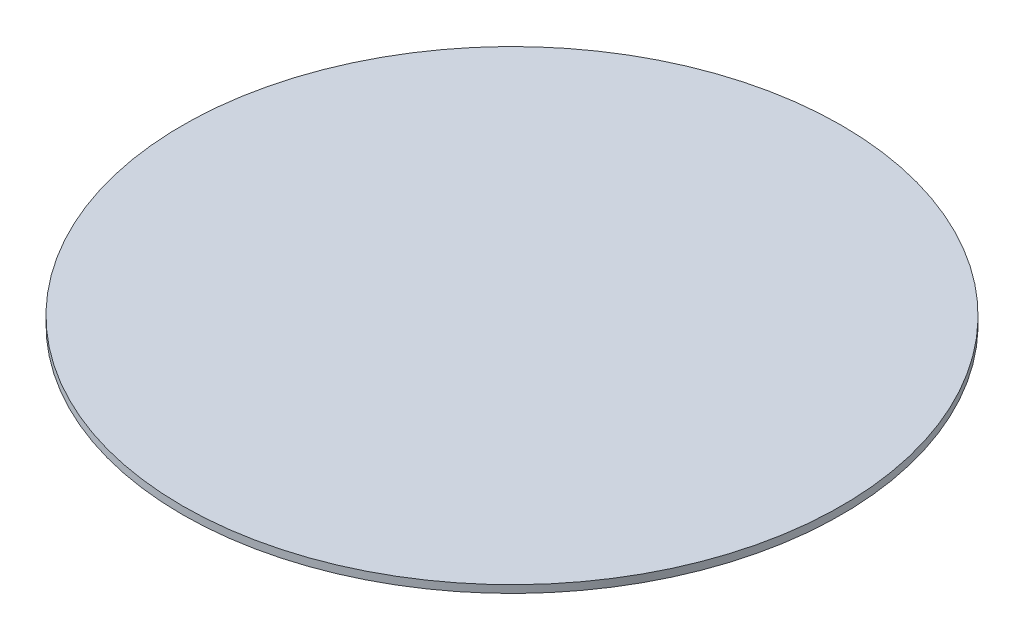
ISO-10303-21;
HEADER;
FILE_DESCRIPTION(('STEP AP214'),'2;1');
FILE_NAME('part.step','',(''),(''),'','','');
FILE_SCHEMA(('AUTOMOTIVE_DESIGN { 1 0 10303 214 1 1 1 1 }'));
ENDSEC;
DATA;
#1=APPLICATION_CONTEXT('core data for automotive mechanical design processes');
#2=APPLICATION_PROTOCOL_DEFINITION('international standard','automotive_design',2000,#1);
#3=PRODUCT_CONTEXT('',#1,'mechanical');
#4=PRODUCT('Part','Part','',(#3));
#5=PRODUCT_RELATED_PRODUCT_CATEGORY('part','',(#4));
#6=PRODUCT_DEFINITION_FORMATION('','',#4);
#7=PRODUCT_DEFINITION_CONTEXT('part definition',#1,'design');
#8=PRODUCT_DEFINITION('design','',#6,#7);
#9=PRODUCT_DEFINITION_SHAPE('','',#8);
#10=(LENGTH_UNIT() NAMED_UNIT(*) SI_UNIT(.MILLI.,.METRE.));
#11=(NAMED_UNIT(*) PLANE_ANGLE_UNIT() SI_UNIT($,.RADIAN.));
#12=(NAMED_UNIT(*) SI_UNIT($,.STERADIAN.) SOLID_ANGLE_UNIT());
#13=UNCERTAINTY_MEASURE_WITH_UNIT(LENGTH_MEASURE(1.E-05),#10,'distance_accuracy_value','');
#14=(GEOMETRIC_REPRESENTATION_CONTEXT(3) GLOBAL_UNCERTAINTY_ASSIGNED_CONTEXT((#13)) GLOBAL_UNIT_ASSIGNED_CONTEXT((#10,
#11,#12)) REPRESENTATION_CONTEXT('',''));
#15=CARTESIAN_POINT('',(0.,0.,0.));
#16=DIRECTION('',(0.,0.,1.));
#17=DIRECTION('',(1.,0.,0.));
#18=AXIS2_PLACEMENT_3D('',#15,#16,#17);
#19=CARTESIAN_POINT('',(0.,3.,0.));
#20=DIRECTION('',(0.,-1.,0.));
#21=DIRECTION('',(0.,0.,-1.));
#22=AXIS2_PLACEMENT_3D('',#19,#20,#21);
#23=CYLINDRICAL_SURFACE('',#22,130.);
#24=CARTESIAN_POINT('',(0.,3.,0.));
#25=DIRECTION('',(0.,1.,0.));
#26=DIRECTION('',(0.,0.,1.));
#27=AXIS2_PLACEMENT_3D('',#24,#25,#26);
#28=CIRCLE('',#27,130.);
#29=CARTESIAN_POINT('',(0.,3.,130.));
#30=VERTEX_POINT('',#29);
#31=EDGE_CURVE('E10',#30,#30,#28,.T.);
#32=ORIENTED_EDGE('',*,*,#31,.F.);
#33=EDGE_LOOP('',(#32));
#34=FACE_BOUND('',#33,.T.);
#35=CARTESIAN_POINT('',(0.,0.,0.));
#36=DIRECTION('',(0.,1.,0.));
#37=DIRECTION('',(0.,0.,1.));
#38=AXIS2_PLACEMENT_3D('',#35,#36,#37);
#39=CIRCLE('',#38,130.);
#40=CARTESIAN_POINT('',(0.,0.,130.));
#41=VERTEX_POINT('',#40);
#42=EDGE_CURVE('E34',#41,#41,#39,.T.);
#43=ORIENTED_EDGE('',*,*,#42,.T.);
#44=EDGE_LOOP('',(#43));
#45=FACE_BOUND('',#44,.T.);
#46=ADVANCED_FACE('F31',(#34,#45),#23,.T.);
#47=CARTESIAN_POINT('',(0.,3.,0.));
#48=DIRECTION('',(0.,1.,0.));
#49=DIRECTION('',(0.,0.,1.));
#50=AXIS2_PLACEMENT_3D('',#47,#48,#49);
#51=PLANE('',#50);
#52=ORIENTED_EDGE('',*,*,#31,.T.);
#53=EDGE_LOOP('',(#52));
#54=FACE_BOUND('',#53,.T.);
#55=ADVANCED_FACE('F46',(#54),#51,.T.);
#56=CARTESIAN_POINT('',(0.,0.,0.));
#57=DIRECTION('',(0.,1.,0.));
#58=DIRECTION('',(0.,0.,1.));
#59=AXIS2_PLACEMENT_3D('',#56,#57,#58);
#60=PLANE('',#59);
#61=ORIENTED_EDGE('',*,*,#42,.F.);
#62=EDGE_LOOP('',(#61));
#63=FACE_BOUND('',#62,.T.);
#64=ADVANCED_FACE('F44',(#63),#60,.F.);
#65=CLOSED_SHELL('',(#46,#55,#64));
#66=MANIFOLD_SOLID_BREP('B2',#65);
#67=ADVANCED_BREP_SHAPE_REPRESENTATION('',(#18,#66),#14);
#68=SHAPE_DEFINITION_REPRESENTATION(#9,#67);
ENDSEC;
END-ISO-10303-21;
